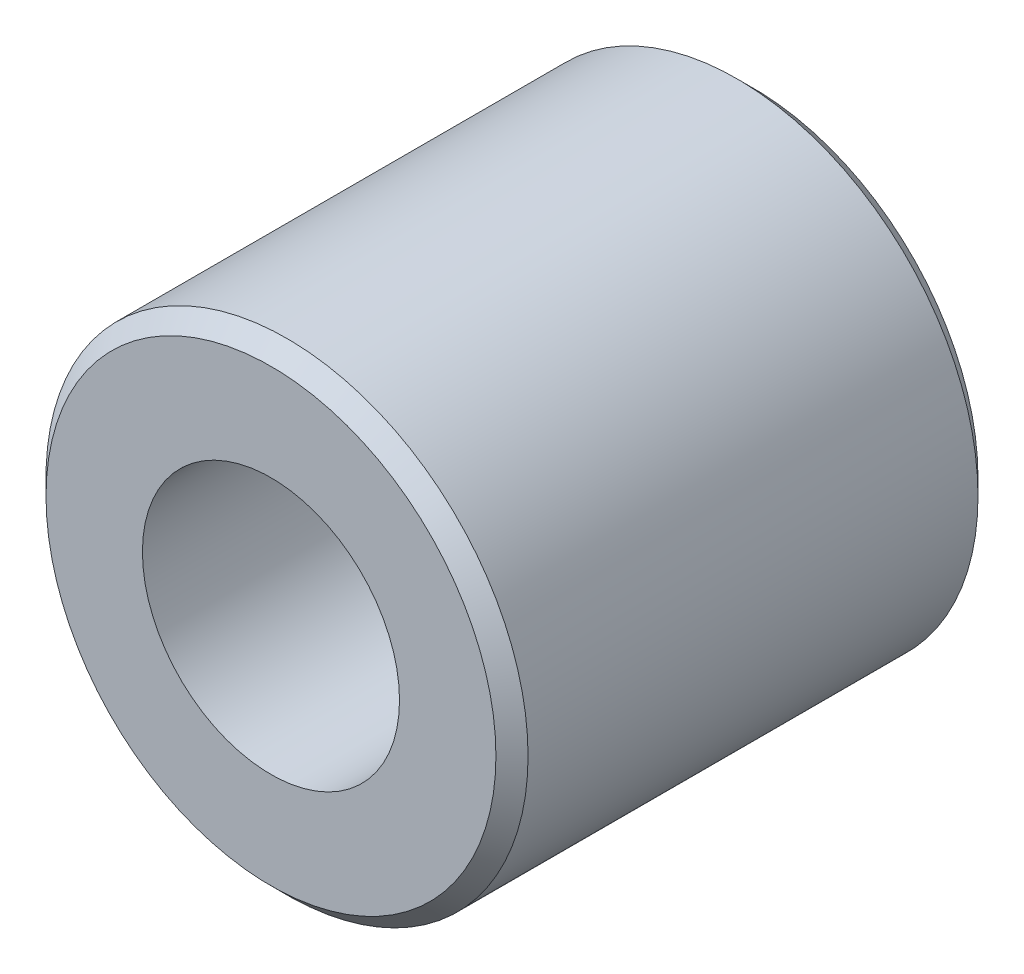
ISO-10303-21;
HEADER;
FILE_DESCRIPTION(('STEP AP214'),'2;1');
FILE_NAME('part.step','',(''),(''),'','','');
FILE_SCHEMA(('AUTOMOTIVE_DESIGN { 1 0 10303 214 1 1 1 1 }'));
ENDSEC;
DATA;
#1=APPLICATION_CONTEXT('core data for automotive mechanical design processes');
#2=APPLICATION_PROTOCOL_DEFINITION('international standard','automotive_design',2000,#1);
#3=PRODUCT_CONTEXT('',#1,'mechanical');
#4=PRODUCT('Part','Part','',(#3));
#5=PRODUCT_RELATED_PRODUCT_CATEGORY('part','',(#4));
#6=PRODUCT_DEFINITION_FORMATION('','',#4);
#7=PRODUCT_DEFINITION_CONTEXT('part definition',#1,'design');
#8=PRODUCT_DEFINITION('design','',#6,#7);
#9=PRODUCT_DEFINITION_SHAPE('','',#8);
#10=(LENGTH_UNIT() NAMED_UNIT(*) SI_UNIT(.MILLI.,.METRE.));
#11=(NAMED_UNIT(*) PLANE_ANGLE_UNIT() SI_UNIT($,.RADIAN.));
#12=(NAMED_UNIT(*) SI_UNIT($,.STERADIAN.) SOLID_ANGLE_UNIT());
#13=UNCERTAINTY_MEASURE_WITH_UNIT(LENGTH_MEASURE(1.E-05),#10,'distance_accuracy_value','');
#14=(GEOMETRIC_REPRESENTATION_CONTEXT(3) GLOBAL_UNCERTAINTY_ASSIGNED_CONTEXT((#13)) GLOBAL_UNIT_ASSIGNED_CONTEXT((#10,
#11,#12)) REPRESENTATION_CONTEXT('',''));
#15=CARTESIAN_POINT('',(0.,0.,0.));
#16=DIRECTION('',(0.,0.,1.));
#17=DIRECTION('',(1.,0.,0.));
#18=AXIS2_PLACEMENT_3D('',#15,#16,#17);
#19=CARTESIAN_POINT('',(0.,0.,7.5));
#20=DIRECTION('',(0.,0.,1.));
#21=DIRECTION('',(1.,0.,0.));
#22=AXIS2_PLACEMENT_3D('',#19,#20,#21);
#23=PLANE('',#22);
#24=CARTESIAN_POINT('',(0.,0.,7.5));
#25=DIRECTION('',(0.,0.,1.));
#26=DIRECTION('',(1.,0.,0.));
#27=AXIS2_PLACEMENT_3D('',#24,#25,#26);
#28=CIRCLE('',#27,7.);
#29=CARTESIAN_POINT('',(7.,0.,7.5));
#30=VERTEX_POINT('',#29);
#31=EDGE_CURVE('E47',#30,#30,#28,.T.);
#32=ORIENTED_EDGE('',*,*,#31,.T.);
#33=EDGE_LOOP('',(#32));
#34=FACE_BOUND('',#33,.T.);
#35=CARTESIAN_POINT('',(0.,0.,7.5));
#36=DIRECTION('',(0.,0.,1.));
#37=DIRECTION('',(1.,0.,0.));
#38=AXIS2_PLACEMENT_3D('',#35,#36,#37);
#39=CIRCLE('',#38,4.);
#40=CARTESIAN_POINT('',(4.,0.,7.5));
#41=VERTEX_POINT('',#40);
#42=EDGE_CURVE('E60',#41,#41,#39,.T.);
#43=ORIENTED_EDGE('',*,*,#42,.F.);
#44=EDGE_LOOP('',(#43));
#45=FACE_BOUND('',#44,.T.);
#46=ADVANCED_FACE('F39',(#34,#45),#23,.T.);
#47=CARTESIAN_POINT('',(0.,0.,-7.5));
#48=DIRECTION('',(0.,0.,1.));
#49=DIRECTION('',(1.,0.,0.));
#50=AXIS2_PLACEMENT_3D('',#47,#48,#49);
#51=PLANE('',#50);
#52=CARTESIAN_POINT('',(0.,0.,-7.5));
#53=DIRECTION('',(0.,0.,1.));
#54=DIRECTION('',(1.,0.,0.));
#55=AXIS2_PLACEMENT_3D('',#52,#53,#54);
#56=CIRCLE('',#55,6.99999999999999);
#57=CARTESIAN_POINT('',(6.99999999999999,0.,-7.5));
#58=VERTEX_POINT('',#57);
#59=EDGE_CURVE('E51',#58,#58,#56,.F.);
#60=ORIENTED_EDGE('',*,*,#59,.T.);
#61=EDGE_LOOP('',(#60));
#62=FACE_BOUND('',#61,.T.);
#63=CARTESIAN_POINT('',(0.,0.,-7.5));
#64=DIRECTION('',(0.,0.,1.));
#65=DIRECTION('',(1.,0.,0.));
#66=AXIS2_PLACEMENT_3D('',#63,#64,#65);
#67=CIRCLE('',#66,4.);
#68=CARTESIAN_POINT('',(4.,0.,-7.5));
#69=VERTEX_POINT('',#68);
#70=EDGE_CURVE('E61',#69,#69,#67,.T.);
#71=ORIENTED_EDGE('',*,*,#70,.T.);
#72=EDGE_LOOP('',(#71));
#73=FACE_BOUND('',#72,.T.);
#74=ADVANCED_FACE('F71',(#62,#73),#51,.F.);
#75=CARTESIAN_POINT('',(0.,0.,7.5));
#76=DIRECTION('',(0.,0.,-1.));
#77=DIRECTION('',(-1.,0.,0.));
#78=AXIS2_PLACEMENT_3D('',#75,#76,#77);
#79=CYLINDRICAL_SURFACE('',#78,7.5);
#80=CARTESIAN_POINT('',(0.,0.,7.));
#81=DIRECTION('',(0.,0.,1.));
#82=DIRECTION('',(1.,0.,0.));
#83=AXIS2_PLACEMENT_3D('',#80,#81,#82);
#84=CIRCLE('',#83,7.5);
#85=CARTESIAN_POINT('',(7.5,0.,7.));
#86=VERTEX_POINT('',#85);
#87=EDGE_CURVE('E10',#86,#86,#84,.F.);
#88=ORIENTED_EDGE('',*,*,#87,.T.);
#89=EDGE_LOOP('',(#88));
#90=FACE_BOUND('',#89,.T.);
#91=CARTESIAN_POINT('',(0.,0.,-7.));
#92=DIRECTION('',(0.,0.,1.));
#93=DIRECTION('',(1.,0.,0.));
#94=AXIS2_PLACEMENT_3D('',#91,#92,#93);
#95=CIRCLE('',#94,7.5);
#96=CARTESIAN_POINT('',(7.5,0.,-7.));
#97=VERTEX_POINT('',#96);
#98=EDGE_CURVE('E55',#97,#97,#95,.T.);
#99=ORIENTED_EDGE('',*,*,#98,.T.);
#100=EDGE_LOOP('',(#99));
#101=FACE_BOUND('',#100,.T.);
#102=ADVANCED_FACE('F78',(#90,#101),#79,.T.);
#103=CARTESIAN_POINT('',(0.,0.,7.5));
#104=DIRECTION('',(0.,0.,-1.));
#105=DIRECTION('',(-1.,0.,0.));
#106=AXIS2_PLACEMENT_3D('',#103,#104,#105);
#107=CYLINDRICAL_SURFACE('',#106,4.);
#108=ORIENTED_EDGE('',*,*,#42,.T.);
#109=EDGE_LOOP('',(#108));
#110=FACE_BOUND('',#109,.T.);
#111=ORIENTED_EDGE('',*,*,#70,.F.);
#112=EDGE_LOOP('',(#111));
#113=FACE_BOUND('',#112,.T.);
#114=ADVANCED_FACE('F67',(#110,#113),#107,.F.);
#115=CARTESIAN_POINT('',(0.,0.,-7.));
#116=DIRECTION('',(0.,0.,1.));
#117=DIRECTION('',(1.,0.,0.));
#118=AXIS2_PLACEMENT_3D('',#115,#116,#117);
#119=CONICAL_SURFACE('',#118,7.5,0.785398163397449);
#120=ORIENTED_EDGE('',*,*,#59,.F.);
#121=EDGE_LOOP('',(#120));
#122=FACE_BOUND('',#121,.T.);
#123=ORIENTED_EDGE('',*,*,#98,.F.);
#124=EDGE_LOOP('',(#123));
#125=FACE_BOUND('',#124,.T.);
#126=ADVANCED_FACE('F84',(#122,#125),#119,.T.);
#127=CARTESIAN_POINT('',(0.,0.,7.5));
#128=DIRECTION('',(0.,0.,-1.));
#129=DIRECTION('',(-1.,0.,0.));
#130=AXIS2_PLACEMENT_3D('',#127,#128,#129);
#131=CONICAL_SURFACE('',#130,7.,0.785398163397447);
#132=ORIENTED_EDGE('',*,*,#87,.F.);
#133=EDGE_LOOP('',(#132));
#134=FACE_BOUND('',#133,.T.);
#135=ORIENTED_EDGE('',*,*,#31,.F.);
#136=EDGE_LOOP('',(#135));
#137=FACE_BOUND('',#136,.T.);
#138=ADVANCED_FACE('F42',(#134,#137),#131,.T.);
#139=CLOSED_SHELL('',(#46,#74,#102,#114,#126,#138));
#140=MANIFOLD_SOLID_BREP('B2',#139);
#141=ADVANCED_BREP_SHAPE_REPRESENTATION('',(#18,#140),#14);
#142=SHAPE_DEFINITION_REPRESENTATION(#9,#141);
ENDSEC;
END-ISO-10303-21;
